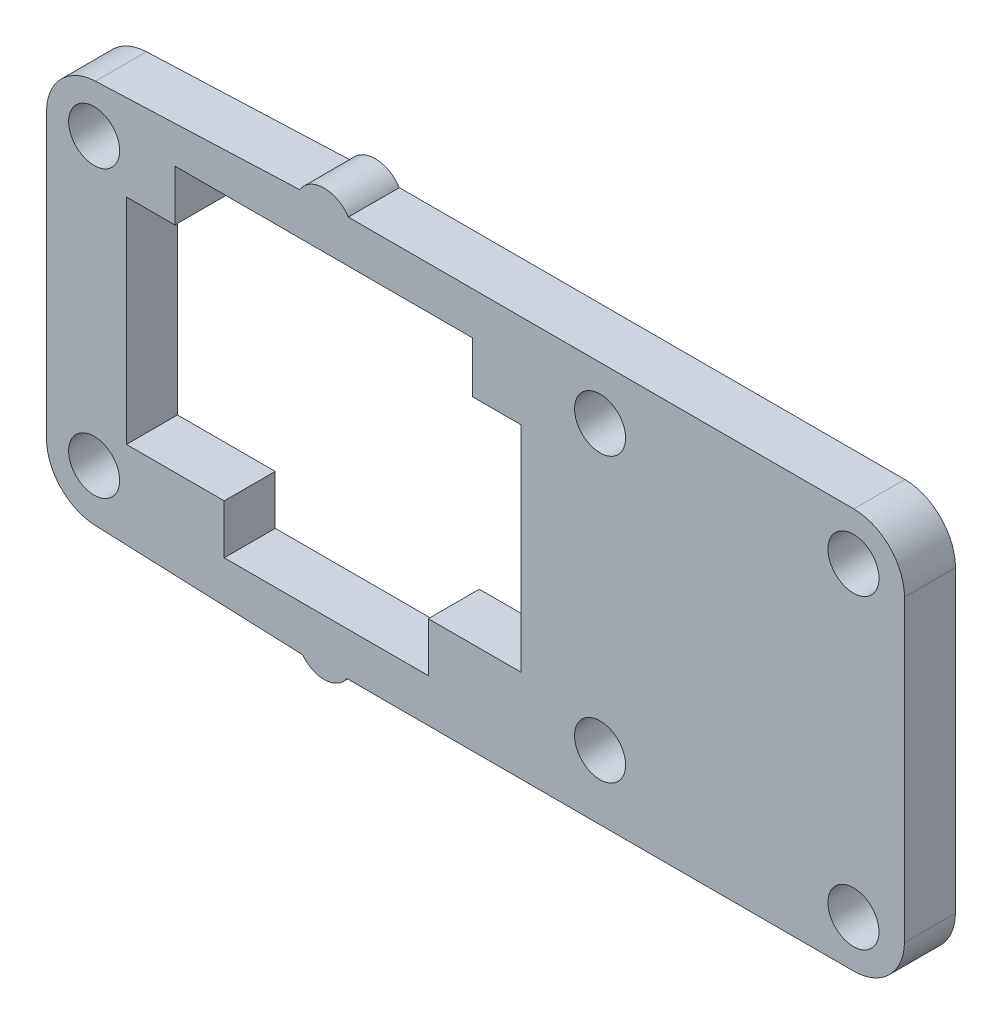
ISO-10303-21;
HEADER;
FILE_DESCRIPTION(('STEP AP214'),'2;1');
FILE_NAME('part.step','',(''),(''),'','','');
FILE_SCHEMA(('AUTOMOTIVE_DESIGN { 1 0 10303 214 1 1 1 1 }'));
ENDSEC;
DATA;
#1=APPLICATION_CONTEXT('core data for automotive mechanical design processes');
#2=APPLICATION_PROTOCOL_DEFINITION('international standard','automotive_design',2000,#1);
#3=PRODUCT_CONTEXT('',#1,'mechanical');
#4=PRODUCT('Part','Part','',(#3));
#5=PRODUCT_RELATED_PRODUCT_CATEGORY('part','',(#4));
#6=PRODUCT_DEFINITION_FORMATION('','',#4);
#7=PRODUCT_DEFINITION_CONTEXT('part definition',#1,'design');
#8=PRODUCT_DEFINITION('design','',#6,#7);
#9=PRODUCT_DEFINITION_SHAPE('','',#8);
#10=(LENGTH_UNIT() NAMED_UNIT(*) SI_UNIT(.MILLI.,.METRE.));
#11=(NAMED_UNIT(*) PLANE_ANGLE_UNIT() SI_UNIT($,.RADIAN.));
#12=(NAMED_UNIT(*) SI_UNIT($,.STERADIAN.) SOLID_ANGLE_UNIT());
#13=UNCERTAINTY_MEASURE_WITH_UNIT(LENGTH_MEASURE(1.E-05),#10,'distance_accuracy_value','');
#14=(GEOMETRIC_REPRESENTATION_CONTEXT(3) GLOBAL_UNCERTAINTY_ASSIGNED_CONTEXT((#13)) GLOBAL_UNIT_ASSIGNED_CONTEXT((#10,
#11,#12)) REPRESENTATION_CONTEXT('',''));
#15=CARTESIAN_POINT('',(0.,0.,0.));
#16=DIRECTION('',(0.,0.,1.));
#17=DIRECTION('',(1.,0.,0.));
#18=AXIS2_PLACEMENT_3D('',#15,#16,#17);
#19=CARTESIAN_POINT('',(44.6500000010314,17.1342889963561,3.));
#20=DIRECTION('',(0.,0.,1.));
#21=DIRECTION('',(1.,0.,0.));
#22=AXIS2_PLACEMENT_3D('',#19,#20,#21);
#23=PLANE('',#22);
#24=CARTESIAN_POINT('',(0.,0.,3.));
#25=DIRECTION('',(0.,0.,1.));
#26=DIRECTION('',(1.,0.,0.));
#27=AXIS2_PLACEMENT_3D('',#24,#25,#26);
#28=CIRCLE('',#27,1.50000000001316);
#29=CARTESIAN_POINT('',(1.50000000001316,0.,3.));
#30=VERTEX_POINT('',#29);
#31=EDGE_CURVE('E736',#30,#30,#28,.T.);
#32=ORIENTED_EDGE('',*,*,#31,.F.);
#33=EDGE_LOOP('',(#32));
#34=FACE_BOUND('',#33,.T.);
#35=CARTESIAN_POINT('',(44.6500000000223,-0.66578946450218,3.));
#36=DIRECTION('',(0.,0.,1.));
#37=DIRECTION('',(1.,0.,0.));
#38=AXIS2_PLACEMENT_3D('',#35,#36,#37);
#39=CIRCLE('',#38,1.50000000001316);
#40=CARTESIAN_POINT('',(46.1500000000355,-0.66578946450218,3.));
#41=VERTEX_POINT('',#40);
#42=EDGE_CURVE('E748',#41,#41,#39,.T.);
#43=ORIENTED_EDGE('',*,*,#42,.F.);
#44=EDGE_LOOP('',(#43));
#45=FACE_BOUND('',#44,.T.);
#46=CARTESIAN_POINT('',(29.7500000002709,17.0265839223642,3.));
#47=DIRECTION('',(0.,0.,1.));
#48=DIRECTION('',(1.,0.,0.));
#49=AXIS2_PLACEMENT_3D('',#46,#47,#48);
#50=CIRCLE('',#49,1.50000000001316);
#51=CARTESIAN_POINT('',(31.2500000002841,17.0265839223642,3.));
#52=VERTEX_POINT('',#51);
#53=EDGE_CURVE('E246',#52,#52,#50,.T.);
#54=ORIENTED_EDGE('',*,*,#53,.F.);
#55=EDGE_LOOP('',(#54));
#56=FACE_BOUND('',#55,.T.);
#57=CARTESIAN_POINT('',(44.6500000010314,17.1342889963561,3.));
#58=DIRECTION('',(0.,0.,1.));
#59=DIRECTION('',(1.,0.,0.));
#60=AXIS2_PLACEMENT_3D('',#57,#58,#59);
#61=CIRCLE('',#60,3.0000000000012);
#62=CARTESIAN_POINT('',(47.6500000000066,17.1342105356719,3.));
#63=VERTEX_POINT('',#62);
#64=CARTESIAN_POINT('',(44.671696981906,20.1342105355015,3.));
#65=VERTEX_POINT('',#64);
#66=EDGE_CURVE('E296',#63,#65,#61,.T.);
#67=ORIENTED_EDGE('',*,*,#66,.T.);
#68=DIRECTION('',(-1.,0.,0.));
#69=VECTOR('',#68,1.);
#70=CARTESIAN_POINT('',(44.671696981906,20.1342105355015,3.));
#71=LINE('',#70,#69);
#72=CARTESIAN_POINT('',(14.9487448141388,20.1342105355015,3.));
#73=VERTEX_POINT('',#72);
#74=EDGE_CURVE('E299',#65,#73,#71,.T.);
#75=ORIENTED_EDGE('',*,*,#74,.T.);
#76=CARTESIAN_POINT('',(13.5287448141359,19.2014125107363,3.));
#77=DIRECTION('',(0.,0.,1.));
#78=DIRECTION('',(1.,0.,0.));
#79=AXIS2_PLACEMENT_3D('',#76,#77,#78);
#80=CIRCLE('',#79,1.69897385354042);
#81=CARTESIAN_POINT('',(12.0868527657652,20.099999999999,3.));
#82=VERTEX_POINT('',#81);
#83=EDGE_CURVE('E302',#73,#82,#80,.T.);
#84=ORIENTED_EDGE('',*,*,#83,.T.);
#85=DIRECTION('',(-0.999197661979531,-0.0400503719662901,0.));
#86=VECTOR('',#85,1.);
#87=CARTESIAN_POINT('',(12.0868527657652,20.099999999999,3.));
#88=LINE('',#87,#86);
#89=CARTESIAN_POINT('',(0.079653817632981,19.618721067467,3.));
#90=VERTEX_POINT('',#89);
#91=EDGE_CURVE('E304',#82,#90,#88,.T.);
#92=ORIENTED_EDGE('',*,*,#91,.T.);
#93=CARTESIAN_POINT('',(0.199804933536145,16.6211280815274,3.));
#94=DIRECTION('',(0.,0.,1.));
#95=DIRECTION('',(1.,0.,0.));
#96=AXIS2_PLACEMENT_3D('',#93,#94,#95);
#97=CIRCLE('',#96,3.0000000000012);
#98=CARTESIAN_POINT('',(-2.80000000000003,16.655338617028,3.));
#99=VERTEX_POINT('',#98);
#100=EDGE_CURVE('E306',#90,#99,#97,.T.);
#101=ORIENTED_EDGE('',*,*,#100,.T.);
#102=DIRECTION('',(0.,-1.,0.));
#103=VECTOR('',#102,1.);
#104=CARTESIAN_POINT('',(-2.80000000000003,16.655338617028,3.));
#105=LINE('',#104,#103);
#106=CARTESIAN_POINT('',(-2.80000000000002,0.0130824539809584,3.));
#107=VERTEX_POINT('',#106);
#108=EDGE_CURVE('E308',#99,#107,#105,.T.);
#109=ORIENTED_EDGE('',*,*,#108,.T.);
#110=CARTESIAN_POINT('',(0.19982644690468,-0.0191865475265046,3.));
#111=DIRECTION('',(0.,0.,1.));
#112=DIRECTION('',(1.,0.,0.));
#113=AXIS2_PLACEMENT_3D('',#110,#111,#112);
#114=CIRCLE('',#113,3.0000000000012);
#115=CARTESIAN_POINT('',(0.252672106571444,-3.01872106745815,3.));
#116=VERTEX_POINT('',#115);
#117=EDGE_CURVE('E310',#107,#116,#114,.T.);
#118=ORIENTED_EDGE('',*,*,#117,.T.);
#119=DIRECTION('',(0.999197661979497,-0.040050371967143,0.));
#120=VECTOR('',#119,1.);
#121=CARTESIAN_POINT('',(0.252672106571444,-3.01872106745815,3.));
#122=LINE('',#121,#120);
#123=CARTESIAN_POINT('',(12.2598710547032,-3.50000000000036,3.));
#124=VERTEX_POINT('',#123);
#125=EDGE_CURVE('E312',#116,#124,#122,.T.);
#126=ORIENTED_EDGE('',*,*,#125,.T.);
#127=CARTESIAN_POINT('',(13.5287448141363,-2.53299143973587,3.));
#128=DIRECTION('',(0.,0.,1.));
#129=DIRECTION('',(1.,0.,0.));
#130=AXIS2_PLACEMENT_3D('',#127,#128,#129);
#131=CIRCLE('',#130,1.59535142617623);
#132=CARTESIAN_POINT('',(14.8621373324814,-3.40889700828977,3.));
#133=VERTEX_POINT('',#132);
#134=EDGE_CURVE('E314',#124,#133,#131,.T.);
#135=ORIENTED_EDGE('',*,*,#134,.T.);
#136=DIRECTION('',(1.,0.,0.));
#137=VECTOR('',#136,1.);
#138=CARTESIAN_POINT('',(14.8621373324814,-3.40889700828977,3.));
#139=LINE('',#138,#137);
#140=CARTESIAN_POINT('',(44.5850895002486,-3.40889700828977,3.));
#141=VERTEX_POINT('',#140);
#142=EDGE_CURVE('E316',#133,#141,#139,.T.);
#143=ORIENTED_EDGE('',*,*,#142,.T.);
#144=CARTESIAN_POINT('',(44.6505260541127,-0.409610750290118,3.));
#145=DIRECTION('',(0.,0.,1.));
#146=DIRECTION('',(1.,0.,0.));
#147=AXIS2_PLACEMENT_3D('',#144,#145,#146);
#148=CIRCLE('',#147,3.0000000000012);
#149=CARTESIAN_POINT('',(47.6500000000066,-0.465789464328056,3.));
#150=VERTEX_POINT('',#149);
#151=EDGE_CURVE('E318',#141,#150,#148,.T.);
#152=ORIENTED_EDGE('',*,*,#151,.T.);
#153=DIRECTION('',(0.,1.,0.));
#154=VECTOR('',#153,1.);
#155=CARTESIAN_POINT('',(47.6500000000066,-0.465789464328056,3.));
#156=LINE('',#155,#154);
#157=EDGE_CURVE('E320',#150,#63,#156,.T.);
#158=ORIENTED_EDGE('',*,*,#157,.T.);
#159=EDGE_LOOP('',(#67,#75,#84,#92,#101,#109,#118,#126,#135,#143,#152,#158));
#160=FACE_BOUND('',#159,.T.);
#161=DIRECTION('',(-1.,0.,0.));
#162=VECTOR('',#161,1.);
#163=CARTESIAN_POINT('',(4.7500000000103,14.6342105350741,3.));
#164=LINE('',#163,#162);
#165=CARTESIAN_POINT('',(4.7500000000103,14.6342105350741,3.));
#166=VERTEX_POINT('',#165);
#167=CARTESIAN_POINT('',(1.9000000000005,14.6342105350741,3.));
#168=VERTEX_POINT('',#167);
#169=EDGE_CURVE('E208',#166,#168,#164,.T.);
#170=ORIENTED_EDGE('',*,*,#169,.F.);
#171=DIRECTION('',(0.,-1.,0.));
#172=VECTOR('',#171,1.);
#173=CARTESIAN_POINT('',(4.7500000000103,17.6342105355054,3.));
#174=LINE('',#173,#172);
#175=CARTESIAN_POINT('',(4.7500000000103,17.6342105355054,3.));
#176=VERTEX_POINT('',#175);
#177=EDGE_CURVE('E200',#176,#166,#174,.T.);
#178=ORIENTED_EDGE('',*,*,#177,.F.);
#179=DIRECTION('',(-1.,0.,0.));
#180=VECTOR('',#179,1.);
#181=CARTESIAN_POINT('',(22.2500000001163,17.6342105355054,3.));
#182=LINE('',#181,#180);
#183=CARTESIAN_POINT('',(22.2500000001163,17.6342105355054,3.));
#184=VERTEX_POINT('',#183);
#185=EDGE_CURVE('E243',#184,#176,#182,.T.);
#186=ORIENTED_EDGE('',*,*,#185,.F.);
#187=DIRECTION('',(0.,1.,0.));
#188=VECTOR('',#187,1.);
#189=CARTESIAN_POINT('',(22.2500000001163,14.6342105350741,3.));
#190=LINE('',#189,#188);
#191=CARTESIAN_POINT('',(22.2500000001163,14.6342105350741,3.));
#192=VERTEX_POINT('',#191);
#193=EDGE_CURVE('E241',#192,#184,#190,.T.);
#194=ORIENTED_EDGE('',*,*,#193,.F.);
#195=DIRECTION('',(-1.,0.,0.));
#196=VECTOR('',#195,1.);
#197=CARTESIAN_POINT('',(25.1000000000014,14.6342105350741,3.));
#198=LINE('',#197,#196);
#199=CARTESIAN_POINT('',(25.1000000000014,14.6342105350741,3.));
#200=VERTEX_POINT('',#199);
#201=EDGE_CURVE('E239',#200,#192,#198,.T.);
#202=ORIENTED_EDGE('',*,*,#201,.F.);
#203=DIRECTION('',(0.,1.,0.));
#204=VECTOR('',#203,1.);
#205=CARTESIAN_POINT('',(25.1000000000014,2.03421053506039,3.));
#206=LINE('',#205,#204);
#207=CARTESIAN_POINT('',(25.1000000000014,2.03421053506039,3.));
#208=VERTEX_POINT('',#207);
#209=EDGE_CURVE('E237',#208,#200,#206,.T.);
#210=ORIENTED_EDGE('',*,*,#209,.F.);
#211=DIRECTION('',(1.,0.,0.));
#212=VECTOR('',#211,1.);
#213=CARTESIAN_POINT('',(19.6500000000087,2.03421053506039,3.));
#214=LINE('',#213,#212);
#215=CARTESIAN_POINT('',(19.6500000000087,2.03421053506039,3.));
#216=VERTEX_POINT('',#215);
#217=EDGE_CURVE('E235',#216,#208,#214,.T.);
#218=ORIENTED_EDGE('',*,*,#217,.F.);
#219=DIRECTION('',(0.,1.,0.));
#220=VECTOR('',#219,1.);
#221=CARTESIAN_POINT('',(19.6500000000087,-0.865789464935293,3.));
#222=LINE('',#221,#220);
#223=CARTESIAN_POINT('',(19.6500000000087,-0.865789464935293,3.));
#224=VERTEX_POINT('',#223);
#225=EDGE_CURVE('E233',#224,#216,#222,.T.);
#226=ORIENTED_EDGE('',*,*,#225,.F.);
#227=DIRECTION('',(1.,0.,0.));
#228=VECTOR('',#227,1.);
#229=CARTESIAN_POINT('',(7.65000000000866,-0.865789464935293,3.));
#230=LINE('',#229,#228);
#231=CARTESIAN_POINT('',(7.65000000000866,-0.865789464935293,3.));
#232=VERTEX_POINT('',#231);
#233=EDGE_CURVE('E231',#232,#224,#230,.T.);
#234=ORIENTED_EDGE('',*,*,#233,.F.);
#235=DIRECTION('',(0.,-1.,0.));
#236=VECTOR('',#235,1.);
#237=CARTESIAN_POINT('',(7.65000000000866,2.03421053506039,3.));
#238=LINE('',#237,#236);
#239=CARTESIAN_POINT('',(7.65000000000866,2.03421053506039,3.));
#240=VERTEX_POINT('',#239);
#241=EDGE_CURVE('E229',#240,#232,#238,.T.);
#242=ORIENTED_EDGE('',*,*,#241,.F.);
#243=DIRECTION('',(1.,0.,0.));
#244=VECTOR('',#243,1.);
#245=CARTESIAN_POINT('',(1.9000000000005,2.03421053506039,3.));
#246=LINE('',#245,#244);
#247=CARTESIAN_POINT('',(1.9000000000005,2.03421053506039,3.));
#248=VERTEX_POINT('',#247);
#249=EDGE_CURVE('E224',#248,#240,#246,.T.);
#250=ORIENTED_EDGE('',*,*,#249,.F.);
#251=DIRECTION('',(0.,-1.,0.));
#252=VECTOR('',#251,1.);
#253=CARTESIAN_POINT('',(1.9000000000005,14.6342105350741,3.));
#254=LINE('',#253,#252);
#255=EDGE_CURVE('E222',#168,#248,#254,.T.);
#256=ORIENTED_EDGE('',*,*,#255,.F.);
#257=EDGE_LOOP('',(#170,#178,#186,#194,#202,#210,#218,#226,#234,#242,#250,#256));
#258=FACE_BOUND('',#257,.T.);
#259=CARTESIAN_POINT('',(44.6500000000034,17.3342105355014,3.));
#260=DIRECTION('',(0.,0.,1.));
#261=DIRECTION('',(1.,0.,0.));
#262=AXIS2_PLACEMENT_3D('',#259,#260,#261);
#263=CIRCLE('',#262,1.50000000001317);
#264=CARTESIAN_POINT('',(46.1500000000165,17.3342105355014,3.));
#265=VERTEX_POINT('',#264);
#266=EDGE_CURVE('E754',#265,#265,#263,.T.);
#267=ORIENTED_EDGE('',*,*,#266,.F.);
#268=EDGE_LOOP('',(#267));
#269=FACE_BOUND('',#268,.T.);
#270=CARTESIAN_POINT('',(29.7500000000533,0.383476378574504,3.));
#271=DIRECTION('',(0.,0.,1.));
#272=DIRECTION('',(1.,0.,0.));
#273=AXIS2_PLACEMENT_3D('',#270,#271,#272);
#274=CIRCLE('',#273,1.50000000001316);
#275=CARTESIAN_POINT('',(31.2500000000665,0.383476378574504,3.));
#276=VERTEX_POINT('',#275);
#277=EDGE_CURVE('E742',#276,#276,#274,.T.);
#278=ORIENTED_EDGE('',*,*,#277,.F.);
#279=EDGE_LOOP('',(#278));
#280=FACE_BOUND('',#279,.T.);
#281=CARTESIAN_POINT('',(5.05125184301763E-11,16.7875921520778,3.));
#282=DIRECTION('',(0.,0.,1.));
#283=DIRECTION('',(1.,0.,0.));
#284=AXIS2_PLACEMENT_3D('',#281,#282,#283);
#285=CIRCLE('',#284,1.50000000001316);
#286=CARTESIAN_POINT('',(1.50000000006368,16.7875921520778,3.));
#287=VERTEX_POINT('',#286);
#288=EDGE_CURVE('E727',#287,#287,#285,.T.);
#289=ORIENTED_EDGE('',*,*,#288,.F.);
#290=EDGE_LOOP('',(#289));
#291=FACE_BOUND('',#290,.T.);
#292=ADVANCED_FACE('F39',(#34,#45,#56,#160,#258,#269,#280,#291),#23,.T.);
#293=CARTESIAN_POINT('',(44.6500000010314,17.1342889963561,0.));
#294=DIRECTION('',(0.,0.,1.));
#295=DIRECTION('',(1.,0.,0.));
#296=AXIS2_PLACEMENT_3D('',#293,#294,#295);
#297=PLANE('',#296);
#298=CARTESIAN_POINT('',(44.6500000010314,17.1342889963561,0.));
#299=DIRECTION('',(0.,0.,1.));
#300=DIRECTION('',(1.,0.,0.));
#301=AXIS2_PLACEMENT_3D('',#298,#299,#300);
#302=CIRCLE('',#301,3.0000000000012);
#303=CARTESIAN_POINT('',(47.6500000000066,17.1342105356719,0.));
#304=VERTEX_POINT('',#303);
#305=CARTESIAN_POINT('',(44.671696981906,20.1342105355015,0.));
#306=VERTEX_POINT('',#305);
#307=EDGE_CURVE('E216',#304,#306,#302,.T.);
#308=ORIENTED_EDGE('',*,*,#307,.F.);
#309=DIRECTION('',(0.,1.,0.));
#310=VECTOR('',#309,1.);
#311=CARTESIAN_POINT('',(47.6500000000066,-0.465789464328056,0.));
#312=LINE('',#311,#310);
#313=CARTESIAN_POINT('',(47.6500000000066,-0.465789464328056,0.));
#314=VERTEX_POINT('',#313);
#315=EDGE_CURVE('E300',#314,#304,#312,.T.);
#316=ORIENTED_EDGE('',*,*,#315,.F.);
#317=CARTESIAN_POINT('',(44.6505260541127,-0.409610750290118,0.));
#318=DIRECTION('',(0.,0.,1.));
#319=DIRECTION('',(1.,0.,0.));
#320=AXIS2_PLACEMENT_3D('',#317,#318,#319);
#321=CIRCLE('',#320,3.0000000000012);
#322=CARTESIAN_POINT('',(44.5850895002486,-3.40889700828977,0.));
#323=VERTEX_POINT('',#322);
#324=EDGE_CURVE('E343',#323,#314,#321,.T.);
#325=ORIENTED_EDGE('',*,*,#324,.F.);
#326=DIRECTION('',(1.,0.,0.));
#327=VECTOR('',#326,1.);
#328=CARTESIAN_POINT('',(14.8621373324814,-3.40889700828977,0.));
#329=LINE('',#328,#327);
#330=CARTESIAN_POINT('',(14.8621373324814,-3.40889700828977,0.));
#331=VERTEX_POINT('',#330);
#332=EDGE_CURVE('E341',#331,#323,#329,.T.);
#333=ORIENTED_EDGE('',*,*,#332,.F.);
#334=CARTESIAN_POINT('',(13.5287448141363,-2.53299143973587,0.));
#335=DIRECTION('',(0.,0.,1.));
#336=DIRECTION('',(1.,0.,0.));
#337=AXIS2_PLACEMENT_3D('',#334,#335,#336);
#338=CIRCLE('',#337,1.59535142617623);
#339=CARTESIAN_POINT('',(12.2598710547032,-3.50000000000036,0.));
#340=VERTEX_POINT('',#339);
#341=EDGE_CURVE('E339',#340,#331,#338,.T.);
#342=ORIENTED_EDGE('',*,*,#341,.F.);
#343=DIRECTION('',(0.999197661979497,-0.040050371967143,0.));
#344=VECTOR('',#343,1.);
#345=CARTESIAN_POINT('',(0.252672106571444,-3.01872106745815,0.));
#346=LINE('',#345,#344);
#347=CARTESIAN_POINT('',(0.252672106571444,-3.01872106745815,0.));
#348=VERTEX_POINT('',#347);
#349=EDGE_CURVE('E337',#348,#340,#346,.T.);
#350=ORIENTED_EDGE('',*,*,#349,.F.);
#351=CARTESIAN_POINT('',(0.19982644690468,-0.0191865475265046,0.));
#352=DIRECTION('',(0.,0.,1.));
#353=DIRECTION('',(1.,0.,0.));
#354=AXIS2_PLACEMENT_3D('',#351,#352,#353);
#355=CIRCLE('',#354,3.0000000000012);
#356=CARTESIAN_POINT('',(-2.80000000000002,0.0130824539809584,0.));
#357=VERTEX_POINT('',#356);
#358=EDGE_CURVE('E335',#357,#348,#355,.T.);
#359=ORIENTED_EDGE('',*,*,#358,.F.);
#360=DIRECTION('',(0.,-1.,0.));
#361=VECTOR('',#360,1.);
#362=CARTESIAN_POINT('',(-2.80000000000003,16.655338617028,0.));
#363=LINE('',#362,#361);
#364=CARTESIAN_POINT('',(-2.80000000000003,16.655338617028,0.));
#365=VERTEX_POINT('',#364);
#366=EDGE_CURVE('E333',#365,#357,#363,.T.);
#367=ORIENTED_EDGE('',*,*,#366,.F.);
#368=CARTESIAN_POINT('',(0.199804933536145,16.6211280815274,0.));
#369=DIRECTION('',(0.,0.,1.));
#370=DIRECTION('',(1.,0.,0.));
#371=AXIS2_PLACEMENT_3D('',#368,#369,#370);
#372=CIRCLE('',#371,3.0000000000012);
#373=CARTESIAN_POINT('',(0.079653817632981,19.618721067467,0.));
#374=VERTEX_POINT('',#373);
#375=EDGE_CURVE('E331',#374,#365,#372,.T.);
#376=ORIENTED_EDGE('',*,*,#375,.F.);
#377=DIRECTION('',(-0.999197661979531,-0.0400503719662901,0.));
#378=VECTOR('',#377,1.);
#379=CARTESIAN_POINT('',(12.0868527657652,20.099999999999,0.));
#380=LINE('',#379,#378);
#381=CARTESIAN_POINT('',(12.0868527657652,20.099999999999,0.));
#382=VERTEX_POINT('',#381);
#383=EDGE_CURVE('E329',#382,#374,#380,.T.);
#384=ORIENTED_EDGE('',*,*,#383,.F.);
#385=CARTESIAN_POINT('',(13.5287448141359,19.2014125107363,0.));
#386=DIRECTION('',(0.,0.,1.));
#387=DIRECTION('',(1.,0.,0.));
#388=AXIS2_PLACEMENT_3D('',#385,#386,#387);
#389=CIRCLE('',#388,1.69897385354042);
#390=CARTESIAN_POINT('',(14.9487448141388,20.1342105355015,0.));
#391=VERTEX_POINT('',#390);
#392=EDGE_CURVE('E327',#391,#382,#389,.T.);
#393=ORIENTED_EDGE('',*,*,#392,.F.);
#394=DIRECTION('',(-1.,0.,0.));
#395=VECTOR('',#394,1.);
#396=CARTESIAN_POINT('',(44.671696981906,20.1342105355015,0.));
#397=LINE('',#396,#395);
#398=EDGE_CURVE('E325',#306,#391,#397,.T.);
#399=ORIENTED_EDGE('',*,*,#398,.F.);
#400=EDGE_LOOP('',(#308,#316,#325,#333,#342,#350,#359,#367,#376,#384,#393,#399));
#401=FACE_BOUND('',#400,.T.);
#402=DIRECTION('',(0.,-1.,0.));
#403=VECTOR('',#402,1.);
#404=CARTESIAN_POINT('',(4.7500000000103,17.6342105355054,0.));
#405=LINE('',#404,#403);
#406=CARTESIAN_POINT('',(4.7500000000103,17.6342105355054,0.));
#407=VERTEX_POINT('',#406);
#408=CARTESIAN_POINT('',(4.7500000000103,14.6342105350741,0.));
#409=VERTEX_POINT('',#408);
#410=EDGE_CURVE('E62',#407,#409,#405,.T.);
#411=ORIENTED_EDGE('',*,*,#410,.T.);
#412=DIRECTION('',(-1.,0.,0.));
#413=VECTOR('',#412,1.);
#414=CARTESIAN_POINT('',(4.7500000000103,14.6342105350741,0.));
#415=LINE('',#414,#413);
#416=CARTESIAN_POINT('',(1.9000000000005,14.6342105350741,0.));
#417=VERTEX_POINT('',#416);
#418=EDGE_CURVE('E215',#409,#417,#415,.T.);
#419=ORIENTED_EDGE('',*,*,#418,.T.);
#420=DIRECTION('',(0.,-1.,0.));
#421=VECTOR('',#420,1.);
#422=CARTESIAN_POINT('',(1.9000000000005,14.6342105350741,0.));
#423=LINE('',#422,#421);
#424=CARTESIAN_POINT('',(1.9000000000005,2.03421053506039,0.));
#425=VERTEX_POINT('',#424);
#426=EDGE_CURVE('E248',#417,#425,#423,.T.);
#427=ORIENTED_EDGE('',*,*,#426,.T.);
#428=DIRECTION('',(1.,0.,0.));
#429=VECTOR('',#428,1.);
#430=CARTESIAN_POINT('',(1.9000000000005,2.03421053506039,0.));
#431=LINE('',#430,#429);
#432=CARTESIAN_POINT('',(7.65000000000866,2.03421053506039,0.));
#433=VERTEX_POINT('',#432);
#434=EDGE_CURVE('E251',#425,#433,#431,.T.);
#435=ORIENTED_EDGE('',*,*,#434,.T.);
#436=DIRECTION('',(0.,-1.,0.));
#437=VECTOR('',#436,1.);
#438=CARTESIAN_POINT('',(7.65000000000866,2.03421053506039,0.));
#439=LINE('',#438,#437);
#440=CARTESIAN_POINT('',(7.65000000000866,-0.865789464935293,0.));
#441=VERTEX_POINT('',#440);
#442=EDGE_CURVE('E254',#433,#441,#439,.T.);
#443=ORIENTED_EDGE('',*,*,#442,.T.);
#444=DIRECTION('',(1.,0.,0.));
#445=VECTOR('',#444,1.);
#446=CARTESIAN_POINT('',(7.65000000000866,-0.865789464935293,0.));
#447=LINE('',#446,#445);
#448=CARTESIAN_POINT('',(19.6500000000087,-0.865789464935293,0.));
#449=VERTEX_POINT('',#448);
#450=EDGE_CURVE('E257',#441,#449,#447,.T.);
#451=ORIENTED_EDGE('',*,*,#450,.T.);
#452=DIRECTION('',(0.,1.,0.));
#453=VECTOR('',#452,1.);
#454=CARTESIAN_POINT('',(19.6500000000087,-0.865789464935293,0.));
#455=LINE('',#454,#453);
#456=CARTESIAN_POINT('',(19.6500000000087,2.03421053506039,0.));
#457=VERTEX_POINT('',#456);
#458=EDGE_CURVE('E260',#449,#457,#455,.T.);
#459=ORIENTED_EDGE('',*,*,#458,.T.);
#460=DIRECTION('',(1.,0.,0.));
#461=VECTOR('',#460,1.);
#462=CARTESIAN_POINT('',(19.6500000000087,2.03421053506039,0.));
#463=LINE('',#462,#461);
#464=CARTESIAN_POINT('',(25.1000000000014,2.03421053506039,0.));
#465=VERTEX_POINT('',#464);
#466=EDGE_CURVE('E263',#457,#465,#463,.T.);
#467=ORIENTED_EDGE('',*,*,#466,.T.);
#468=DIRECTION('',(0.,1.,0.));
#469=VECTOR('',#468,1.);
#470=CARTESIAN_POINT('',(25.1000000000014,2.03421053506039,0.));
#471=LINE('',#470,#469);
#472=CARTESIAN_POINT('',(25.1000000000014,14.6342105350741,0.));
#473=VERTEX_POINT('',#472);
#474=EDGE_CURVE('E266',#465,#473,#471,.T.);
#475=ORIENTED_EDGE('',*,*,#474,.T.);
#476=DIRECTION('',(-1.,0.,0.));
#477=VECTOR('',#476,1.);
#478=CARTESIAN_POINT('',(25.1000000000014,14.6342105350741,0.));
#479=LINE('',#478,#477);
#480=CARTESIAN_POINT('',(22.2500000001163,14.6342105350741,0.));
#481=VERTEX_POINT('',#480);
#482=EDGE_CURVE('E269',#473,#481,#479,.T.);
#483=ORIENTED_EDGE('',*,*,#482,.T.);
#484=DIRECTION('',(0.,1.,0.));
#485=VECTOR('',#484,1.);
#486=CARTESIAN_POINT('',(22.2500000001163,14.6342105350741,0.));
#487=LINE('',#486,#485);
#488=CARTESIAN_POINT('',(22.2500000001163,17.6342105355054,0.));
#489=VERTEX_POINT('',#488);
#490=EDGE_CURVE('E272',#481,#489,#487,.T.);
#491=ORIENTED_EDGE('',*,*,#490,.T.);
#492=DIRECTION('',(-1.,0.,0.));
#493=VECTOR('',#492,1.);
#494=CARTESIAN_POINT('',(22.2500000001163,17.6342105355054,0.));
#495=LINE('',#494,#493);
#496=EDGE_CURVE('E209',#489,#407,#495,.T.);
#497=ORIENTED_EDGE('',*,*,#496,.T.);
#498=EDGE_LOOP('',(#411,#419,#427,#435,#443,#451,#459,#467,#475,#483,#491,#497));
#499=FACE_BOUND('',#498,.T.);
#500=CARTESIAN_POINT('',(29.7500000002709,17.0265839223642,0.));
#501=DIRECTION('',(0.,0.,1.));
#502=DIRECTION('',(1.,0.,0.));
#503=AXIS2_PLACEMENT_3D('',#500,#501,#502);
#504=CIRCLE('',#503,1.50000000001316);
#505=CARTESIAN_POINT('',(31.2500000002841,17.0265839223642,0.));
#506=VERTEX_POINT('',#505);
#507=EDGE_CURVE('E757',#506,#506,#504,.T.);
#508=ORIENTED_EDGE('',*,*,#507,.T.);
#509=EDGE_LOOP('',(#508));
#510=FACE_BOUND('',#509,.T.);
#511=CARTESIAN_POINT('',(44.6500000000034,17.3342105355014,0.));
#512=DIRECTION('',(0.,0.,1.));
#513=DIRECTION('',(1.,0.,0.));
#514=AXIS2_PLACEMENT_3D('',#511,#512,#513);
#515=CIRCLE('',#514,1.50000000001317);
#516=CARTESIAN_POINT('',(46.1500000000165,17.3342105355014,0.));
#517=VERTEX_POINT('',#516);
#518=EDGE_CURVE('E751',#517,#517,#515,.T.);
#519=ORIENTED_EDGE('',*,*,#518,.T.);
#520=EDGE_LOOP('',(#519));
#521=FACE_BOUND('',#520,.T.);
#522=CARTESIAN_POINT('',(44.6500000000223,-0.66578946450218,0.));
#523=DIRECTION('',(0.,0.,1.));
#524=DIRECTION('',(1.,0.,0.));
#525=AXIS2_PLACEMENT_3D('',#522,#523,#524);
#526=CIRCLE('',#525,1.50000000001316);
#527=CARTESIAN_POINT('',(46.1500000000355,-0.66578946450218,0.));
#528=VERTEX_POINT('',#527);
#529=EDGE_CURVE('E745',#528,#528,#526,.T.);
#530=ORIENTED_EDGE('',*,*,#529,.T.);
#531=EDGE_LOOP('',(#530));
#532=FACE_BOUND('',#531,.T.);
#533=CARTESIAN_POINT('',(29.7500000000533,0.383476378574504,0.));
#534=DIRECTION('',(0.,0.,1.));
#535=DIRECTION('',(1.,0.,0.));
#536=AXIS2_PLACEMENT_3D('',#533,#534,#535);
#537=CIRCLE('',#536,1.50000000001316);
#538=CARTESIAN_POINT('',(31.2500000000665,0.383476378574504,0.));
#539=VERTEX_POINT('',#538);
#540=EDGE_CURVE('E739',#539,#539,#537,.T.);
#541=ORIENTED_EDGE('',*,*,#540,.T.);
#542=EDGE_LOOP('',(#541));
#543=FACE_BOUND('',#542,.T.);
#544=CARTESIAN_POINT('',(0.,0.,0.));
#545=DIRECTION('',(0.,0.,1.));
#546=DIRECTION('',(1.,0.,0.));
#547=AXIS2_PLACEMENT_3D('',#544,#545,#546);
#548=CIRCLE('',#547,1.50000000001316);
#549=CARTESIAN_POINT('',(1.50000000001316,0.,0.));
#550=VERTEX_POINT('',#549);
#551=EDGE_CURVE('E733',#550,#550,#548,.T.);
#552=ORIENTED_EDGE('',*,*,#551,.T.);
#553=EDGE_LOOP('',(#552));
#554=FACE_BOUND('',#553,.T.);
#555=CARTESIAN_POINT('',(5.05125184301763E-11,16.7875921520778,0.));
#556=DIRECTION('',(0.,0.,1.));
#557=DIRECTION('',(1.,0.,0.));
#558=AXIS2_PLACEMENT_3D('',#555,#556,#557);
#559=CIRCLE('',#558,1.50000000001316);
#560=CARTESIAN_POINT('',(1.50000000006368,16.7875921520778,0.));
#561=VERTEX_POINT('',#560);
#562=EDGE_CURVE('E730',#561,#561,#559,.T.);
#563=ORIENTED_EDGE('',*,*,#562,.T.);
#564=EDGE_LOOP('',(#563));
#565=FACE_BOUND('',#564,.T.);
#566=ADVANCED_FACE('F385',(#401,#499,#510,#521,#532,#543,#554,#565),#297,.F.);
#567=CARTESIAN_POINT('',(44.6500000010314,17.1342889963561,3.));
#568=DIRECTION('',(0.,0.,-1.));
#569=DIRECTION('',(-1.,0.,0.));
#570=AXIS2_PLACEMENT_3D('',#567,#568,#569);
#571=CYLINDRICAL_SURFACE('',#570,3.0000000000012);
#572=ORIENTED_EDGE('',*,*,#307,.T.);
#573=DIRECTION('',(0.,0.,-1.));
#574=VECTOR('',#573,1.);
#575=CARTESIAN_POINT('',(44.671696981906,20.1342105355015,3.));
#576=LINE('',#575,#574);
#577=EDGE_CURVE('E11',#65,#306,#576,.T.);
#578=ORIENTED_EDGE('',*,*,#577,.F.);
#579=ORIENTED_EDGE('',*,*,#66,.F.);
#580=DIRECTION('',(0.,0.,-1.));
#581=VECTOR('',#580,1.);
#582=CARTESIAN_POINT('',(47.6500000000066,17.1342105356719,3.));
#583=LINE('',#582,#581);
#584=EDGE_CURVE('E322',#63,#304,#583,.T.);
#585=ORIENTED_EDGE('',*,*,#584,.T.);
#586=EDGE_LOOP('',(#572,#578,#579,#585));
#587=FACE_BOUND('',#586,.T.);
#588=ADVANCED_FACE('F41',(#587),#571,.T.);
#589=CARTESIAN_POINT('',(44.671696981906,20.1342105355015,3.));
#590=DIRECTION('',(0.,-1.,0.));
#591=DIRECTION('',(1.,0.,0.));
#592=AXIS2_PLACEMENT_3D('',#589,#590,#591);
#593=PLANE('',#592);
#594=ORIENTED_EDGE('',*,*,#398,.T.);
#595=DIRECTION('',(0.,0.,-1.));
#596=VECTOR('',#595,1.);
#597=CARTESIAN_POINT('',(14.9487448141388,20.1342105355015,3.));
#598=LINE('',#597,#596);
#599=EDGE_CURVE('E47',#73,#391,#598,.T.);
#600=ORIENTED_EDGE('',*,*,#599,.F.);
#601=ORIENTED_EDGE('',*,*,#74,.F.);
#602=ORIENTED_EDGE('',*,*,#577,.T.);
#603=EDGE_LOOP('',(#594,#600,#601,#602));
#604=FACE_BOUND('',#603,.T.);
#605=ADVANCED_FACE('F402',(#604),#593,.F.);
#606=CARTESIAN_POINT('',(13.5287448141359,19.2014125107363,3.));
#607=DIRECTION('',(0.,0.,-1.));
#608=DIRECTION('',(-1.,0.,0.));
#609=AXIS2_PLACEMENT_3D('',#606,#607,#608);
#610=CYLINDRICAL_SURFACE('',#609,1.69897385354042);
#611=ORIENTED_EDGE('',*,*,#392,.T.);
#612=DIRECTION('',(0.,0.,-1.));
#613=VECTOR('',#612,1.);
#614=CARTESIAN_POINT('',(12.0868527657652,20.099999999999,3.));
#615=LINE('',#614,#613);
#616=EDGE_CURVE('E372',#82,#382,#615,.T.);
#617=ORIENTED_EDGE('',*,*,#616,.F.);
#618=ORIENTED_EDGE('',*,*,#83,.F.);
#619=ORIENTED_EDGE('',*,*,#599,.T.);
#620=EDGE_LOOP('',(#611,#617,#618,#619));
#621=FACE_BOUND('',#620,.T.);
#622=ADVANCED_FACE('F379',(#621),#610,.T.);
#623=CARTESIAN_POINT('',(12.0868527657652,20.099999999999,3.));
#624=DIRECTION('',(0.0400503719662901,-0.999197661979531,0.));
#625=DIRECTION('',(0.999197661979532,0.0400503719662901,0.));
#626=AXIS2_PLACEMENT_3D('',#623,#624,#625);
#627=PLANE('',#626);
#628=ORIENTED_EDGE('',*,*,#383,.T.);
#629=DIRECTION('',(0.,0.,-1.));
#630=VECTOR('',#629,1.);
#631=CARTESIAN_POINT('',(0.079653817632981,19.618721067467,3.));
#632=LINE('',#631,#630);
#633=EDGE_CURVE('E369',#90,#374,#632,.T.);
#634=ORIENTED_EDGE('',*,*,#633,.F.);
#635=ORIENTED_EDGE('',*,*,#91,.F.);
#636=ORIENTED_EDGE('',*,*,#616,.T.);
#637=EDGE_LOOP('',(#628,#634,#635,#636));
#638=FACE_BOUND('',#637,.T.);
#639=ADVANCED_FACE('F391',(#638),#627,.F.);
#640=CARTESIAN_POINT('',(0.199804933536145,16.6211280815274,3.));
#641=DIRECTION('',(0.,0.,-1.));
#642=DIRECTION('',(-1.,0.,0.));
#643=AXIS2_PLACEMENT_3D('',#640,#641,#642);
#644=CYLINDRICAL_SURFACE('',#643,3.0000000000012);
#645=ORIENTED_EDGE('',*,*,#375,.T.);
#646=DIRECTION('',(0.,0.,-1.));
#647=VECTOR('',#646,1.);
#648=CARTESIAN_POINT('',(-2.80000000000003,16.655338617028,3.));
#649=LINE('',#648,#647);
#650=EDGE_CURVE('E366',#99,#365,#649,.T.);
#651=ORIENTED_EDGE('',*,*,#650,.F.);
#652=ORIENTED_EDGE('',*,*,#100,.F.);
#653=ORIENTED_EDGE('',*,*,#633,.T.);
#654=EDGE_LOOP('',(#645,#651,#652,#653));
#655=FACE_BOUND('',#654,.T.);
#656=ADVANCED_FACE('F395',(#655),#644,.T.);
#657=CARTESIAN_POINT('',(-2.80000000000003,16.655338617028,3.));
#658=DIRECTION('',(1.,0.,0.));
#659=DIRECTION('',(0.,1.,0.));
#660=AXIS2_PLACEMENT_3D('',#657,#658,#659);
#661=PLANE('',#660);
#662=ORIENTED_EDGE('',*,*,#366,.T.);
#663=DIRECTION('',(0.,0.,-1.));
#664=VECTOR('',#663,1.);
#665=CARTESIAN_POINT('',(-2.80000000000002,0.0130824539809584,3.));
#666=LINE('',#665,#664);
#667=EDGE_CURVE('E363',#107,#357,#666,.T.);
#668=ORIENTED_EDGE('',*,*,#667,.F.);
#669=ORIENTED_EDGE('',*,*,#108,.F.);
#670=ORIENTED_EDGE('',*,*,#650,.T.);
#671=EDGE_LOOP('',(#662,#668,#669,#670));
#672=FACE_BOUND('',#671,.T.);
#673=ADVANCED_FACE('F435',(#672),#661,.F.);
#674=CARTESIAN_POINT('',(0.19982644690468,-0.0191865475265046,3.));
#675=DIRECTION('',(0.,0.,-1.));
#676=DIRECTION('',(-1.,0.,0.));
#677=AXIS2_PLACEMENT_3D('',#674,#675,#676);
#678=CYLINDRICAL_SURFACE('',#677,3.0000000000012);
#679=ORIENTED_EDGE('',*,*,#358,.T.);
#680=DIRECTION('',(0.,0.,-1.));
#681=VECTOR('',#680,1.);
#682=CARTESIAN_POINT('',(0.252672106571444,-3.01872106745815,3.));
#683=LINE('',#682,#681);
#684=EDGE_CURVE('E360',#116,#348,#683,.T.);
#685=ORIENTED_EDGE('',*,*,#684,.F.);
#686=ORIENTED_EDGE('',*,*,#117,.F.);
#687=ORIENTED_EDGE('',*,*,#667,.T.);
#688=EDGE_LOOP('',(#679,#685,#686,#687));
#689=FACE_BOUND('',#688,.T.);
#690=ADVANCED_FACE('F433',(#689),#678,.T.);
#691=CARTESIAN_POINT('',(0.252672106571444,-3.01872106745815,3.));
#692=DIRECTION('',(0.040050371967143,0.999197661979497,0.));
#693=DIRECTION('',(-0.999197661979497,0.040050371967143,0.));
#694=AXIS2_PLACEMENT_3D('',#691,#692,#693);
#695=PLANE('',#694);
#696=ORIENTED_EDGE('',*,*,#349,.T.);
#697=DIRECTION('',(0.,0.,-1.));
#698=VECTOR('',#697,1.);
#699=CARTESIAN_POINT('',(12.2598710547032,-3.50000000000036,3.));
#700=LINE('',#699,#698);
#701=EDGE_CURVE('E357',#124,#340,#700,.T.);
#702=ORIENTED_EDGE('',*,*,#701,.F.);
#703=ORIENTED_EDGE('',*,*,#125,.F.);
#704=ORIENTED_EDGE('',*,*,#684,.T.);
#705=EDGE_LOOP('',(#696,#702,#703,#704));
#706=FACE_BOUND('',#705,.T.);
#707=ADVANCED_FACE('F429',(#706),#695,.F.);
#708=CARTESIAN_POINT('',(13.5287448141363,-2.53299143973587,3.));
#709=DIRECTION('',(0.,0.,-1.));
#710=DIRECTION('',(-1.,0.,0.));
#711=AXIS2_PLACEMENT_3D('',#708,#709,#710);
#712=CYLINDRICAL_SURFACE('',#711,1.59535142617623);
#713=ORIENTED_EDGE('',*,*,#341,.T.);
#714=DIRECTION('',(0.,0.,-1.));
#715=VECTOR('',#714,1.);
#716=CARTESIAN_POINT('',(14.8621373324814,-3.40889700828977,3.));
#717=LINE('',#716,#715);
#718=EDGE_CURVE('E354',#133,#331,#717,.T.);
#719=ORIENTED_EDGE('',*,*,#718,.F.);
#720=ORIENTED_EDGE('',*,*,#134,.F.);
#721=ORIENTED_EDGE('',*,*,#701,.T.);
#722=EDGE_LOOP('',(#713,#719,#720,#721));
#723=FACE_BOUND('',#722,.T.);
#724=ADVANCED_FACE('F424',(#723),#712,.T.);
#725=CARTESIAN_POINT('',(14.8621373324814,-3.40889700828977,3.));
#726=DIRECTION('',(0.,1.,0.));
#727=DIRECTION('',(0.,0.,1.));
#728=AXIS2_PLACEMENT_3D('',#725,#726,#727);
#729=PLANE('',#728);
#730=ORIENTED_EDGE('',*,*,#332,.T.);
#731=DIRECTION('',(0.,0.,-1.));
#732=VECTOR('',#731,1.);
#733=CARTESIAN_POINT('',(44.5850895002486,-3.40889700828977,3.));
#734=LINE('',#733,#732);
#735=EDGE_CURVE('E351',#141,#323,#734,.T.);
#736=ORIENTED_EDGE('',*,*,#735,.F.);
#737=ORIENTED_EDGE('',*,*,#142,.F.);
#738=ORIENTED_EDGE('',*,*,#718,.T.);
#739=EDGE_LOOP('',(#730,#736,#737,#738));
#740=FACE_BOUND('',#739,.T.);
#741=ADVANCED_FACE('F418',(#740),#729,.F.);
#742=CARTESIAN_POINT('',(44.6505260541127,-0.409610750290118,3.));
#743=DIRECTION('',(0.,0.,-1.));
#744=DIRECTION('',(-1.,0.,0.));
#745=AXIS2_PLACEMENT_3D('',#742,#743,#744);
#746=CYLINDRICAL_SURFACE('',#745,3.0000000000012);
#747=ORIENTED_EDGE('',*,*,#324,.T.);
#748=DIRECTION('',(0.,0.,-1.));
#749=VECTOR('',#748,1.);
#750=CARTESIAN_POINT('',(47.6500000000066,-0.465789464328056,3.));
#751=LINE('',#750,#749);
#752=EDGE_CURVE('E348',#150,#314,#751,.T.);
#753=ORIENTED_EDGE('',*,*,#752,.F.);
#754=ORIENTED_EDGE('',*,*,#151,.F.);
#755=ORIENTED_EDGE('',*,*,#735,.T.);
#756=EDGE_LOOP('',(#747,#753,#754,#755));
#757=FACE_BOUND('',#756,.T.);
#758=ADVANCED_FACE('F414',(#757),#746,.T.);
#759=CARTESIAN_POINT('',(47.6500000000066,-0.465789464328056,3.));
#760=DIRECTION('',(-1.,0.,0.));
#761=DIRECTION('',(0.,-1.,0.));
#762=AXIS2_PLACEMENT_3D('',#759,#760,#761);
#763=PLANE('',#762);
#764=ORIENTED_EDGE('',*,*,#315,.T.);
#765=ORIENTED_EDGE('',*,*,#584,.F.);
#766=ORIENTED_EDGE('',*,*,#157,.F.);
#767=ORIENTED_EDGE('',*,*,#752,.T.);
#768=EDGE_LOOP('',(#764,#765,#766,#767));
#769=FACE_BOUND('',#768,.T.);
#770=ADVANCED_FACE('F409',(#769),#763,.F.);
#771=CARTESIAN_POINT('',(4.7500000000103,17.6342105355054,3.));
#772=DIRECTION('',(1.,0.,0.));
#773=DIRECTION('',(0.,1.,0.));
#774=AXIS2_PLACEMENT_3D('',#771,#772,#773);
#775=PLANE('',#774);
#776=ORIENTED_EDGE('',*,*,#410,.F.);
#777=DIRECTION('',(0.,0.,-1.));
#778=VECTOR('',#777,1.);
#779=CARTESIAN_POINT('',(4.7500000000103,17.6342105355054,3.));
#780=LINE('',#779,#778);
#781=EDGE_CURVE('E204',#176,#407,#780,.T.);
#782=ORIENTED_EDGE('',*,*,#781,.F.);
#783=ORIENTED_EDGE('',*,*,#177,.T.);
#784=DIRECTION('',(0.,0.,-1.));
#785=VECTOR('',#784,1.);
#786=CARTESIAN_POINT('',(4.7500000000103,14.6342105350741,3.));
#787=LINE('',#786,#785);
#788=EDGE_CURVE('E203',#166,#409,#787,.T.);
#789=ORIENTED_EDGE('',*,*,#788,.T.);
#790=EDGE_LOOP('',(#776,#782,#783,#789));
#791=FACE_BOUND('',#790,.T.);
#792=ADVANCED_FACE('F202',(#791),#775,.T.);
#793=CARTESIAN_POINT('',(4.7500000000103,14.6342105350741,3.));
#794=DIRECTION('',(0.,-1.,0.));
#795=DIRECTION('',(0.,0.,-1.));
#796=AXIS2_PLACEMENT_3D('',#793,#794,#795);
#797=PLANE('',#796);
#798=ORIENTED_EDGE('',*,*,#418,.F.);
#799=ORIENTED_EDGE('',*,*,#788,.F.);
#800=ORIENTED_EDGE('',*,*,#169,.T.);
#801=DIRECTION('',(0.,0.,-1.));
#802=VECTOR('',#801,1.);
#803=CARTESIAN_POINT('',(1.9000000000005,14.6342105350741,3.));
#804=LINE('',#803,#802);
#805=EDGE_CURVE('E217',#168,#417,#804,.T.);
#806=ORIENTED_EDGE('',*,*,#805,.T.);
#807=EDGE_LOOP('',(#798,#799,#800,#806));
#808=FACE_BOUND('',#807,.T.);
#809=ADVANCED_FACE('F212',(#808),#797,.T.);
#810=CARTESIAN_POINT('',(1.9000000000005,14.6342105350741,3.));
#811=DIRECTION('',(1.,0.,0.));
#812=DIRECTION('',(0.,1.,0.));
#813=AXIS2_PLACEMENT_3D('',#810,#811,#812);
#814=PLANE('',#813);
#815=ORIENTED_EDGE('',*,*,#426,.F.);
#816=ORIENTED_EDGE('',*,*,#805,.F.);
#817=ORIENTED_EDGE('',*,*,#255,.T.);
#818=DIRECTION('',(0.,0.,-1.));
#819=VECTOR('',#818,1.);
#820=CARTESIAN_POINT('',(1.9000000000005,2.03421053506039,3.));
#821=LINE('',#820,#819);
#822=EDGE_CURVE('E293',#248,#425,#821,.T.);
#823=ORIENTED_EDGE('',*,*,#822,.T.);
#824=EDGE_LOOP('',(#815,#816,#817,#823));
#825=FACE_BOUND('',#824,.T.);
#826=ADVANCED_FACE('F496',(#825),#814,.T.);
#827=CARTESIAN_POINT('',(1.9000000000005,2.03421053506039,3.));
#828=DIRECTION('',(0.,1.,0.));
#829=DIRECTION('',(0.,0.,1.));
#830=AXIS2_PLACEMENT_3D('',#827,#828,#829);
#831=PLANE('',#830);
#832=ORIENTED_EDGE('',*,*,#434,.F.);
#833=ORIENTED_EDGE('',*,*,#822,.F.);
#834=ORIENTED_EDGE('',*,*,#249,.T.);
#835=DIRECTION('',(0.,0.,-1.));
#836=VECTOR('',#835,1.);
#837=CARTESIAN_POINT('',(7.65000000000866,2.03421053506039,3.));
#838=LINE('',#837,#836);
#839=EDGE_CURVE('E291',#240,#433,#838,.T.);
#840=ORIENTED_EDGE('',*,*,#839,.T.);
#841=EDGE_LOOP('',(#832,#833,#834,#840));
#842=FACE_BOUND('',#841,.T.);
#843=ADVANCED_FACE('F502',(#842),#831,.T.);
#844=CARTESIAN_POINT('',(7.65000000000866,2.03421053506039,3.));
#845=DIRECTION('',(1.,0.,0.));
#846=DIRECTION('',(0.,0.,-1.));
#847=AXIS2_PLACEMENT_3D('',#844,#845,#846);
#848=PLANE('',#847);
#849=ORIENTED_EDGE('',*,*,#442,.F.);
#850=ORIENTED_EDGE('',*,*,#839,.F.);
#851=ORIENTED_EDGE('',*,*,#241,.T.);
#852=DIRECTION('',(0.,0.,-1.));
#853=VECTOR('',#852,1.);
#854=CARTESIAN_POINT('',(7.65000000000866,-0.865789464935293,3.));
#855=LINE('',#854,#853);
#856=EDGE_CURVE('E289',#232,#441,#855,.T.);
#857=ORIENTED_EDGE('',*,*,#856,.T.);
#858=EDGE_LOOP('',(#849,#850,#851,#857));
#859=FACE_BOUND('',#858,.T.);
#860=ADVANCED_FACE('F510',(#859),#848,.T.);
#861=CARTESIAN_POINT('',(7.65000000000866,-0.865789464935293,3.));
#862=DIRECTION('',(0.,1.,0.));
#863=DIRECTION('',(0.,0.,1.));
#864=AXIS2_PLACEMENT_3D('',#861,#862,#863);
#865=PLANE('',#864);
#866=ORIENTED_EDGE('',*,*,#450,.F.);
#867=ORIENTED_EDGE('',*,*,#856,.F.);
#868=ORIENTED_EDGE('',*,*,#233,.T.);
#869=DIRECTION('',(0.,0.,-1.));
#870=VECTOR('',#869,1.);
#871=CARTESIAN_POINT('',(19.6500000000087,-0.865789464935293,3.));
#872=LINE('',#871,#870);
#873=EDGE_CURVE('E287',#224,#449,#872,.T.);
#874=ORIENTED_EDGE('',*,*,#873,.T.);
#875=EDGE_LOOP('',(#866,#867,#868,#874));
#876=FACE_BOUND('',#875,.T.);
#877=ADVANCED_FACE('F518',(#876),#865,.T.);
#878=CARTESIAN_POINT('',(19.6500000000087,-0.865789464935293,3.));
#879=DIRECTION('',(-1.,0.,0.));
#880=DIRECTION('',(0.,0.,1.));
#881=AXIS2_PLACEMENT_3D('',#878,#879,#880);
#882=PLANE('',#881);
#883=ORIENTED_EDGE('',*,*,#458,.F.);
#884=ORIENTED_EDGE('',*,*,#873,.F.);
#885=ORIENTED_EDGE('',*,*,#225,.T.);
#886=DIRECTION('',(0.,0.,-1.));
#887=VECTOR('',#886,1.);
#888=CARTESIAN_POINT('',(19.6500000000087,2.03421053506039,3.));
#889=LINE('',#888,#887);
#890=EDGE_CURVE('E285',#216,#457,#889,.T.);
#891=ORIENTED_EDGE('',*,*,#890,.T.);
#892=EDGE_LOOP('',(#883,#884,#885,#891));
#893=FACE_BOUND('',#892,.T.);
#894=ADVANCED_FACE('F526',(#893),#882,.T.);
#895=CARTESIAN_POINT('',(19.6500000000087,2.03421053506039,3.));
#896=DIRECTION('',(0.,1.,0.));
#897=DIRECTION('',(0.,0.,1.));
#898=AXIS2_PLACEMENT_3D('',#895,#896,#897);
#899=PLANE('',#898);
#900=ORIENTED_EDGE('',*,*,#466,.F.);
#901=ORIENTED_EDGE('',*,*,#890,.F.);
#902=ORIENTED_EDGE('',*,*,#217,.T.);
#903=DIRECTION('',(0.,0.,-1.));
#904=VECTOR('',#903,1.);
#905=CARTESIAN_POINT('',(25.1000000000014,2.03421053506039,3.));
#906=LINE('',#905,#904);
#907=EDGE_CURVE('E283',#208,#465,#906,.T.);
#908=ORIENTED_EDGE('',*,*,#907,.T.);
#909=EDGE_LOOP('',(#900,#901,#902,#908));
#910=FACE_BOUND('',#909,.T.);
#911=ADVANCED_FACE('F534',(#910),#899,.T.);
#912=CARTESIAN_POINT('',(25.1000000000014,2.03421053506039,3.));
#913=DIRECTION('',(-1.,0.,0.));
#914=DIRECTION('',(0.,0.,1.));
#915=AXIS2_PLACEMENT_3D('',#912,#913,#914);
#916=PLANE('',#915);
#917=ORIENTED_EDGE('',*,*,#474,.F.);
#918=ORIENTED_EDGE('',*,*,#907,.F.);
#919=ORIENTED_EDGE('',*,*,#209,.T.);
#920=DIRECTION('',(0.,0.,-1.));
#921=VECTOR('',#920,1.);
#922=CARTESIAN_POINT('',(25.1000000000014,14.6342105350741,3.));
#923=LINE('',#922,#921);
#924=EDGE_CURVE('E281',#200,#473,#923,.T.);
#925=ORIENTED_EDGE('',*,*,#924,.T.);
#926=EDGE_LOOP('',(#917,#918,#919,#925));
#927=FACE_BOUND('',#926,.T.);
#928=ADVANCED_FACE('F542',(#927),#916,.T.);
#929=CARTESIAN_POINT('',(25.1000000000014,14.6342105350741,3.));
#930=DIRECTION('',(0.,-1.,0.));
#931=DIRECTION('',(0.,0.,-1.));
#932=AXIS2_PLACEMENT_3D('',#929,#930,#931);
#933=PLANE('',#932);
#934=ORIENTED_EDGE('',*,*,#482,.F.);
#935=ORIENTED_EDGE('',*,*,#924,.F.);
#936=ORIENTED_EDGE('',*,*,#201,.T.);
#937=DIRECTION('',(0.,0.,-1.));
#938=VECTOR('',#937,1.);
#939=CARTESIAN_POINT('',(22.2500000001163,14.6342105350741,3.));
#940=LINE('',#939,#938);
#941=EDGE_CURVE('E279',#192,#481,#940,.T.);
#942=ORIENTED_EDGE('',*,*,#941,.T.);
#943=EDGE_LOOP('',(#934,#935,#936,#942));
#944=FACE_BOUND('',#943,.T.);
#945=ADVANCED_FACE('F550',(#944),#933,.T.);
#946=CARTESIAN_POINT('',(22.2500000001163,14.6342105350741,3.));
#947=DIRECTION('',(-1.,0.,0.));
#948=DIRECTION('',(0.,-1.,0.));
#949=AXIS2_PLACEMENT_3D('',#946,#947,#948);
#950=PLANE('',#949);
#951=ORIENTED_EDGE('',*,*,#490,.F.);
#952=ORIENTED_EDGE('',*,*,#941,.F.);
#953=ORIENTED_EDGE('',*,*,#193,.T.);
#954=DIRECTION('',(0.,0.,-1.));
#955=VECTOR('',#954,1.);
#956=CARTESIAN_POINT('',(22.2500000001163,17.6342105355054,3.));
#957=LINE('',#956,#955);
#958=EDGE_CURVE('E54',#184,#489,#957,.T.);
#959=ORIENTED_EDGE('',*,*,#958,.T.);
#960=EDGE_LOOP('',(#951,#952,#953,#959));
#961=FACE_BOUND('',#960,.T.);
#962=ADVANCED_FACE('F558',(#961),#950,.T.);
#963=CARTESIAN_POINT('',(22.2500000001163,17.6342105355054,3.));
#964=DIRECTION('',(0.,-1.,0.));
#965=DIRECTION('',(0.,0.,-1.));
#966=AXIS2_PLACEMENT_3D('',#963,#964,#965);
#967=PLANE('',#966);
#968=ORIENTED_EDGE('',*,*,#496,.F.);
#969=ORIENTED_EDGE('',*,*,#958,.F.);
#970=ORIENTED_EDGE('',*,*,#185,.T.);
#971=ORIENTED_EDGE('',*,*,#781,.T.);
#972=EDGE_LOOP('',(#968,#969,#970,#971));
#973=FACE_BOUND('',#972,.T.);
#974=ADVANCED_FACE('F566',(#973),#967,.T.);
#975=CARTESIAN_POINT('',(29.7500000002709,17.0265839223642,3.));
#976=DIRECTION('',(0.,0.,-1.));
#977=DIRECTION('',(-1.,0.,0.));
#978=AXIS2_PLACEMENT_3D('',#975,#976,#977);
#979=CYLINDRICAL_SURFACE('',#978,1.50000000001316);
#980=ORIENTED_EDGE('',*,*,#53,.T.);
#981=EDGE_LOOP('',(#980));
#982=FACE_BOUND('',#981,.T.);
#983=ORIENTED_EDGE('',*,*,#507,.F.);
#984=EDGE_LOOP('',(#983));
#985=FACE_BOUND('',#984,.T.);
#986=ADVANCED_FACE('F574',(#982,#985),#979,.F.);
#987=CARTESIAN_POINT('',(44.6500000000034,17.3342105355014,3.));
#988=DIRECTION('',(0.,0.,-1.));
#989=DIRECTION('',(-1.,0.,0.));
#990=AXIS2_PLACEMENT_3D('',#987,#988,#989);
#991=CYLINDRICAL_SURFACE('',#990,1.50000000001317);
#992=ORIENTED_EDGE('',*,*,#266,.T.);
#993=EDGE_LOOP('',(#992));
#994=FACE_BOUND('',#993,.T.);
#995=ORIENTED_EDGE('',*,*,#518,.F.);
#996=EDGE_LOOP('',(#995));
#997=FACE_BOUND('',#996,.T.);
#998=ADVANCED_FACE('F581',(#994,#997),#991,.F.);
#999=CARTESIAN_POINT('',(44.6500000000223,-0.66578946450218,3.));
#1000=DIRECTION('',(0.,0.,-1.));
#1001=DIRECTION('',(-1.,0.,0.));
#1002=AXIS2_PLACEMENT_3D('',#999,#1000,#1001);
#1003=CYLINDRICAL_SURFACE('',#1002,1.50000000001316);
#1004=ORIENTED_EDGE('',*,*,#42,.T.);
#1005=EDGE_LOOP('',(#1004));
#1006=FACE_BOUND('',#1005,.T.);
#1007=ORIENTED_EDGE('',*,*,#529,.F.);
#1008=EDGE_LOOP('',(#1007));
#1009=FACE_BOUND('',#1008,.T.);
#1010=ADVANCED_FACE('F589',(#1006,#1009),#1003,.F.);
#1011=CARTESIAN_POINT('',(29.7500000000533,0.383476378574504,3.));
#1012=DIRECTION('',(0.,0.,-1.));
#1013=DIRECTION('',(-1.,0.,0.));
#1014=AXIS2_PLACEMENT_3D('',#1011,#1012,#1013);
#1015=CYLINDRICAL_SURFACE('',#1014,1.50000000001316);
#1016=ORIENTED_EDGE('',*,*,#277,.T.);
#1017=EDGE_LOOP('',(#1016));
#1018=FACE_BOUND('',#1017,.T.);
#1019=ORIENTED_EDGE('',*,*,#540,.F.);
#1020=EDGE_LOOP('',(#1019));
#1021=FACE_BOUND('',#1020,.T.);
#1022=ADVANCED_FACE('F597',(#1018,#1021),#1015,.F.);
#1023=CARTESIAN_POINT('',(0.,0.,3.));
#1024=DIRECTION('',(0.,0.,-1.));
#1025=DIRECTION('',(-1.,0.,0.));
#1026=AXIS2_PLACEMENT_3D('',#1023,#1024,#1025);
#1027=CYLINDRICAL_SURFACE('',#1026,1.50000000001316);
#1028=ORIENTED_EDGE('',*,*,#31,.T.);
#1029=EDGE_LOOP('',(#1028));
#1030=FACE_BOUND('',#1029,.T.);
#1031=ORIENTED_EDGE('',*,*,#551,.F.);
#1032=EDGE_LOOP('',(#1031));
#1033=FACE_BOUND('',#1032,.T.);
#1034=ADVANCED_FACE('F605',(#1030,#1033),#1027,.F.);
#1035=CARTESIAN_POINT('',(5.05125184301763E-11,16.7875921520778,3.));
#1036=DIRECTION('',(0.,0.,-1.));
#1037=DIRECTION('',(-1.,0.,0.));
#1038=AXIS2_PLACEMENT_3D('',#1035,#1036,#1037);
#1039=CYLINDRICAL_SURFACE('',#1038,1.50000000001316);
#1040=ORIENTED_EDGE('',*,*,#288,.T.);
#1041=EDGE_LOOP('',(#1040));
#1042=FACE_BOUND('',#1041,.T.);
#1043=ORIENTED_EDGE('',*,*,#562,.F.);
#1044=EDGE_LOOP('',(#1043));
#1045=FACE_BOUND('',#1044,.T.);
#1046=ADVANCED_FACE('F613',(#1042,#1045),#1039,.F.);
#1047=CLOSED_SHELL('',(#292,#566,#588,#605,#622,#639,#656,#673,#690,#707,#724,#741,#758,#770,
#792,#809,#826,#843,#860,#877,#894,#911,#928,#945,#962,#974,#986,#998,#1010,#1022,#1034,#1046));
#1048=MANIFOLD_SOLID_BREP('B2',#1047);
#1049=ADVANCED_BREP_SHAPE_REPRESENTATION('',(#18,#1048),#14);
#1050=SHAPE_DEFINITION_REPRESENTATION(#9,#1049);
ENDSEC;
END-ISO-10303-21;
